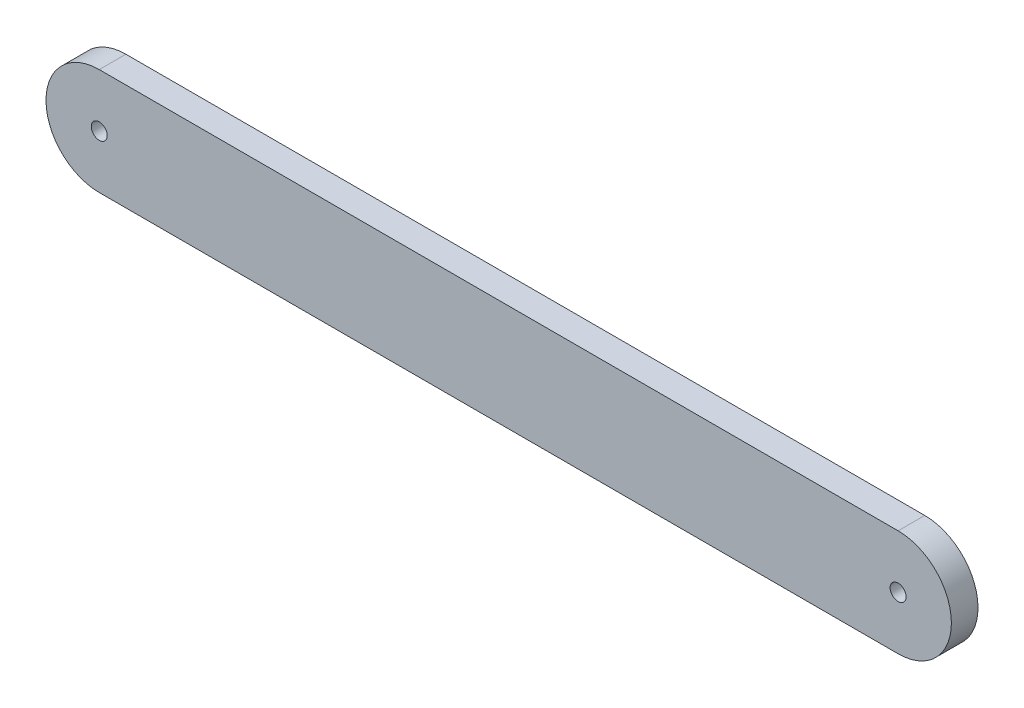
ISO-10303-21;
HEADER;
FILE_DESCRIPTION(('STEP AP214'),'2;1');
FILE_NAME('part.step','',(''),(''),'','','');
FILE_SCHEMA(('AUTOMOTIVE_DESIGN { 1 0 10303 214 1 1 1 1 }'));
ENDSEC;
DATA;
#1=APPLICATION_CONTEXT('core data for automotive mechanical design processes');
#2=APPLICATION_PROTOCOL_DEFINITION('international standard','automotive_design',2000,#1);
#3=PRODUCT_CONTEXT('',#1,'mechanical');
#4=PRODUCT('Part','Part','',(#3));
#5=PRODUCT_RELATED_PRODUCT_CATEGORY('part','',(#4));
#6=PRODUCT_DEFINITION_FORMATION('','',#4);
#7=PRODUCT_DEFINITION_CONTEXT('part definition',#1,'design');
#8=PRODUCT_DEFINITION('design','',#6,#7);
#9=PRODUCT_DEFINITION_SHAPE('','',#8);
#10=(LENGTH_UNIT() NAMED_UNIT(*) SI_UNIT(.MILLI.,.METRE.));
#11=(NAMED_UNIT(*) PLANE_ANGLE_UNIT() SI_UNIT($,.RADIAN.));
#12=(NAMED_UNIT(*) SI_UNIT($,.STERADIAN.) SOLID_ANGLE_UNIT());
#13=UNCERTAINTY_MEASURE_WITH_UNIT(LENGTH_MEASURE(1.E-05),#10,'distance_accuracy_value','');
#14=(GEOMETRIC_REPRESENTATION_CONTEXT(3) GLOBAL_UNCERTAINTY_ASSIGNED_CONTEXT((#13)) GLOBAL_UNIT_ASSIGNED_CONTEXT((#10,
#11,#12)) REPRESENTATION_CONTEXT('',''));
#15=CARTESIAN_POINT('',(0.,0.,0.));
#16=DIRECTION('',(0.,0.,1.));
#17=DIRECTION('',(1.,0.,0.));
#18=AXIS2_PLACEMENT_3D('',#15,#16,#17);
#19=CARTESIAN_POINT('',(-75.,0.,5.));
#20=DIRECTION('',(0.,0.,-1.));
#21=DIRECTION('',(-1.,0.,0.));
#22=AXIS2_PLACEMENT_3D('',#19,#20,#21);
#23=CYLINDRICAL_SURFACE('',#22,10.);
#24=CARTESIAN_POINT('',(-75.,0.,0.));
#25=DIRECTION('',(0.,0.,1.));
#26=DIRECTION('',(1.,0.,0.));
#27=AXIS2_PLACEMENT_3D('',#24,#25,#26);
#28=CIRCLE('',#27,10.);
#29=CARTESIAN_POINT('',(-75.,10.,0.));
#30=VERTEX_POINT('',#29);
#31=CARTESIAN_POINT('',(-75.,-10.,0.));
#32=VERTEX_POINT('',#31);
#33=EDGE_CURVE('E109',#30,#32,#28,.T.);
#34=ORIENTED_EDGE('',*,*,#33,.T.);
#35=DIRECTION('',(0.,0.,-1.));
#36=VECTOR('',#35,1.);
#37=CARTESIAN_POINT('',(-75.,-10.,5.));
#38=LINE('',#37,#36);
#39=CARTESIAN_POINT('',(-75.,-10.,5.));
#40=VERTEX_POINT('',#39);
#41=EDGE_CURVE('E11',#40,#32,#38,.T.);
#42=ORIENTED_EDGE('',*,*,#41,.F.);
#43=CARTESIAN_POINT('',(-75.,0.,5.));
#44=DIRECTION('',(0.,0.,1.));
#45=DIRECTION('',(1.,0.,0.));
#46=AXIS2_PLACEMENT_3D('',#43,#44,#45);
#47=CIRCLE('',#46,10.);
#48=CARTESIAN_POINT('',(-75.,10.,5.));
#49=VERTEX_POINT('',#48);
#50=EDGE_CURVE('E93',#49,#40,#47,.T.);
#51=ORIENTED_EDGE('',*,*,#50,.F.);
#52=DIRECTION('',(0.,0.,-1.));
#53=VECTOR('',#52,1.);
#54=CARTESIAN_POINT('',(-75.,10.,5.));
#55=LINE('',#54,#53);
#56=EDGE_CURVE('E105',#49,#30,#55,.T.);
#57=ORIENTED_EDGE('',*,*,#56,.T.);
#58=EDGE_LOOP('',(#34,#42,#51,#57));
#59=FACE_BOUND('',#58,.T.);
#60=ADVANCED_FACE('F41',(#59),#23,.T.);
#61=CARTESIAN_POINT('',(-75.,-10.,5.));
#62=DIRECTION('',(0.,1.,0.));
#63=DIRECTION('',(0.,0.,1.));
#64=AXIS2_PLACEMENT_3D('',#61,#62,#63);
#65=PLANE('',#64);
#66=DIRECTION('',(1.,0.,0.));
#67=VECTOR('',#66,1.);
#68=CARTESIAN_POINT('',(-75.,-10.,0.));
#69=LINE('',#68,#67);
#70=CARTESIAN_POINT('',(75.,-10.,0.));
#71=VERTEX_POINT('',#70);
#72=EDGE_CURVE('E98',#32,#71,#69,.T.);
#73=ORIENTED_EDGE('',*,*,#72,.T.);
#74=DIRECTION('',(0.,0.,-1.));
#75=VECTOR('',#74,1.);
#76=CARTESIAN_POINT('',(75.,-10.,5.));
#77=LINE('',#76,#75);
#78=CARTESIAN_POINT('',(75.,-10.,5.));
#79=VERTEX_POINT('',#78);
#80=EDGE_CURVE('E50',#79,#71,#77,.T.);
#81=ORIENTED_EDGE('',*,*,#80,.F.);
#82=DIRECTION('',(1.,0.,0.));
#83=VECTOR('',#82,1.);
#84=CARTESIAN_POINT('',(-75.,-10.,5.));
#85=LINE('',#84,#83);
#86=EDGE_CURVE('E88',#40,#79,#85,.T.);
#87=ORIENTED_EDGE('',*,*,#86,.F.);
#88=ORIENTED_EDGE('',*,*,#41,.T.);
#89=EDGE_LOOP('',(#73,#81,#87,#88));
#90=FACE_BOUND('',#89,.T.);
#91=ADVANCED_FACE('F97',(#90),#65,.F.);
#92=CARTESIAN_POINT('',(75.,0.,5.));
#93=DIRECTION('',(0.,0.,-1.));
#94=DIRECTION('',(-1.,0.,0.));
#95=AXIS2_PLACEMENT_3D('',#92,#93,#94);
#96=CYLINDRICAL_SURFACE('',#95,10.);
#97=CARTESIAN_POINT('',(75.,0.,0.));
#98=DIRECTION('',(0.,0.,1.));
#99=DIRECTION('',(1.,0.,0.));
#100=AXIS2_PLACEMENT_3D('',#97,#98,#99);
#101=CIRCLE('',#100,10.);
#102=CARTESIAN_POINT('',(75.,10.,0.));
#103=VERTEX_POINT('',#102);
#104=EDGE_CURVE('E75',#71,#103,#101,.T.);
#105=ORIENTED_EDGE('',*,*,#104,.T.);
#106=DIRECTION('',(0.,0.,-1.));
#107=VECTOR('',#106,1.);
#108=CARTESIAN_POINT('',(75.,10.,5.));
#109=LINE('',#108,#107);
#110=CARTESIAN_POINT('',(75.,10.,5.));
#111=VERTEX_POINT('',#110);
#112=EDGE_CURVE('E100',#111,#103,#109,.T.);
#113=ORIENTED_EDGE('',*,*,#112,.F.);
#114=CARTESIAN_POINT('',(75.,0.,5.));
#115=DIRECTION('',(0.,0.,1.));
#116=DIRECTION('',(1.,0.,0.));
#117=AXIS2_PLACEMENT_3D('',#114,#115,#116);
#118=CIRCLE('',#117,10.);
#119=EDGE_CURVE('E91',#79,#111,#118,.T.);
#120=ORIENTED_EDGE('',*,*,#119,.F.);
#121=ORIENTED_EDGE('',*,*,#80,.T.);
#122=EDGE_LOOP('',(#105,#113,#120,#121));
#123=FACE_BOUND('',#122,.T.);
#124=ADVANCED_FACE('F101',(#123),#96,.T.);
#125=CARTESIAN_POINT('',(-75.,10.,5.));
#126=DIRECTION('',(0.,-1.,0.));
#127=DIRECTION('',(0.,0.,-1.));
#128=AXIS2_PLACEMENT_3D('',#125,#126,#127);
#129=PLANE('',#128);
#130=DIRECTION('',(-1.,0.,0.));
#131=VECTOR('',#130,1.);
#132=CARTESIAN_POINT('',(-75.,10.,0.));
#133=LINE('',#132,#131);
#134=EDGE_CURVE('E81',#103,#30,#133,.T.);
#135=ORIENTED_EDGE('',*,*,#134,.T.);
#136=ORIENTED_EDGE('',*,*,#56,.F.);
#137=DIRECTION('',(-1.,0.,0.));
#138=VECTOR('',#137,1.);
#139=CARTESIAN_POINT('',(-75.,10.,5.));
#140=LINE('',#139,#138);
#141=EDGE_CURVE('E58',#111,#49,#140,.T.);
#142=ORIENTED_EDGE('',*,*,#141,.F.);
#143=ORIENTED_EDGE('',*,*,#112,.T.);
#144=EDGE_LOOP('',(#135,#136,#142,#143));
#145=FACE_BOUND('',#144,.T.);
#146=ADVANCED_FACE('F123',(#145),#129,.F.);
#147=CARTESIAN_POINT('',(-75.,0.,5.));
#148=DIRECTION('',(0.,0.,1.));
#149=DIRECTION('',(1.,0.,0.));
#150=AXIS2_PLACEMENT_3D('',#147,#148,#149);
#151=PLANE('',#150);
#152=CARTESIAN_POINT('',(-75.,0.,5.));
#153=DIRECTION('',(0.,0.,-1.));
#154=DIRECTION('',(-1.,0.,0.));
#155=AXIS2_PLACEMENT_3D('',#152,#153,#154);
#156=CIRCLE('',#155,1.5);
#157=CARTESIAN_POINT('',(-76.5,0.,5.));
#158=VERTEX_POINT('',#157);
#159=EDGE_CURVE('E113',#158,#158,#156,.T.);
#160=ORIENTED_EDGE('',*,*,#159,.T.);
#161=EDGE_LOOP('',(#160));
#162=FACE_BOUND('',#161,.T.);
#163=CARTESIAN_POINT('',(75.,0.,5.));
#164=DIRECTION('',(0.,0.,-1.));
#165=DIRECTION('',(-1.,0.,0.));
#166=AXIS2_PLACEMENT_3D('',#163,#164,#165);
#167=CIRCLE('',#166,1.5);
#168=CARTESIAN_POINT('',(73.5,0.,5.));
#169=VERTEX_POINT('',#168);
#170=EDGE_CURVE('E134',#169,#169,#167,.T.);
#171=ORIENTED_EDGE('',*,*,#170,.T.);
#172=EDGE_LOOP('',(#171));
#173=FACE_BOUND('',#172,.T.);
#174=ORIENTED_EDGE('',*,*,#50,.T.);
#175=ORIENTED_EDGE('',*,*,#86,.T.);
#176=ORIENTED_EDGE('',*,*,#119,.T.);
#177=ORIENTED_EDGE('',*,*,#141,.T.);
#178=EDGE_LOOP('',(#174,#175,#176,#177));
#179=FACE_BOUND('',#178,.T.);
#180=ADVANCED_FACE('F89',(#162,#173,#179),#151,.T.);
#181=CARTESIAN_POINT('',(-75.,0.,0.));
#182=DIRECTION('',(0.,0.,1.));
#183=DIRECTION('',(1.,0.,0.));
#184=AXIS2_PLACEMENT_3D('',#181,#182,#183);
#185=PLANE('',#184);
#186=CARTESIAN_POINT('',(-75.,0.,0.));
#187=DIRECTION('',(0.,0.,-1.));
#188=DIRECTION('',(-1.,0.,0.));
#189=AXIS2_PLACEMENT_3D('',#186,#187,#188);
#190=CIRCLE('',#189,1.5);
#191=CARTESIAN_POINT('',(-76.5,0.,0.));
#192=VERTEX_POINT('',#191);
#193=EDGE_CURVE('E138',#192,#192,#190,.T.);
#194=ORIENTED_EDGE('',*,*,#193,.F.);
#195=EDGE_LOOP('',(#194));
#196=FACE_BOUND('',#195,.T.);
#197=CARTESIAN_POINT('',(75.,0.,0.));
#198=DIRECTION('',(0.,0.,-1.));
#199=DIRECTION('',(-1.,0.,0.));
#200=AXIS2_PLACEMENT_3D('',#197,#198,#199);
#201=CIRCLE('',#200,1.5);
#202=CARTESIAN_POINT('',(73.5,0.,0.));
#203=VERTEX_POINT('',#202);
#204=EDGE_CURVE('E130',#203,#203,#201,.T.);
#205=ORIENTED_EDGE('',*,*,#204,.F.);
#206=EDGE_LOOP('',(#205));
#207=FACE_BOUND('',#206,.T.);
#208=ORIENTED_EDGE('',*,*,#33,.F.);
#209=ORIENTED_EDGE('',*,*,#134,.F.);
#210=ORIENTED_EDGE('',*,*,#104,.F.);
#211=ORIENTED_EDGE('',*,*,#72,.F.);
#212=EDGE_LOOP('',(#208,#209,#210,#211));
#213=FACE_BOUND('',#212,.T.);
#214=ADVANCED_FACE('F126',(#196,#207,#213),#185,.F.);
#215=CARTESIAN_POINT('',(75.,0.,5.));
#216=DIRECTION('',(0.,0.,-1.));
#217=DIRECTION('',(-1.,0.,0.));
#218=AXIS2_PLACEMENT_3D('',#215,#216,#217);
#219=CYLINDRICAL_SURFACE('',#218,1.5);
#220=ORIENTED_EDGE('',*,*,#170,.F.);
#221=EDGE_LOOP('',(#220));
#222=FACE_BOUND('',#221,.T.);
#223=ORIENTED_EDGE('',*,*,#204,.T.);
#224=EDGE_LOOP('',(#223));
#225=FACE_BOUND('',#224,.T.);
#226=ADVANCED_FACE('F151',(#222,#225),#219,.F.);
#227=CARTESIAN_POINT('',(-75.,0.,5.));
#228=DIRECTION('',(0.,0.,-1.));
#229=DIRECTION('',(-1.,0.,0.));
#230=AXIS2_PLACEMENT_3D('',#227,#228,#229);
#231=CYLINDRICAL_SURFACE('',#230,1.5);
#232=ORIENTED_EDGE('',*,*,#159,.F.);
#233=EDGE_LOOP('',(#232));
#234=FACE_BOUND('',#233,.T.);
#235=ORIENTED_EDGE('',*,*,#193,.T.);
#236=EDGE_LOOP('',(#235));
#237=FACE_BOUND('',#236,.T.);
#238=ADVANCED_FACE('F148',(#234,#237),#231,.F.);
#239=CLOSED_SHELL('',(#60,#91,#124,#146,#180,#214,#226,#238));
#240=MANIFOLD_SOLID_BREP('B2',#239);
#241=ADVANCED_BREP_SHAPE_REPRESENTATION('',(#18,#240),#14);
#242=SHAPE_DEFINITION_REPRESENTATION(#9,#241);
ENDSEC;
END-ISO-10303-21;
